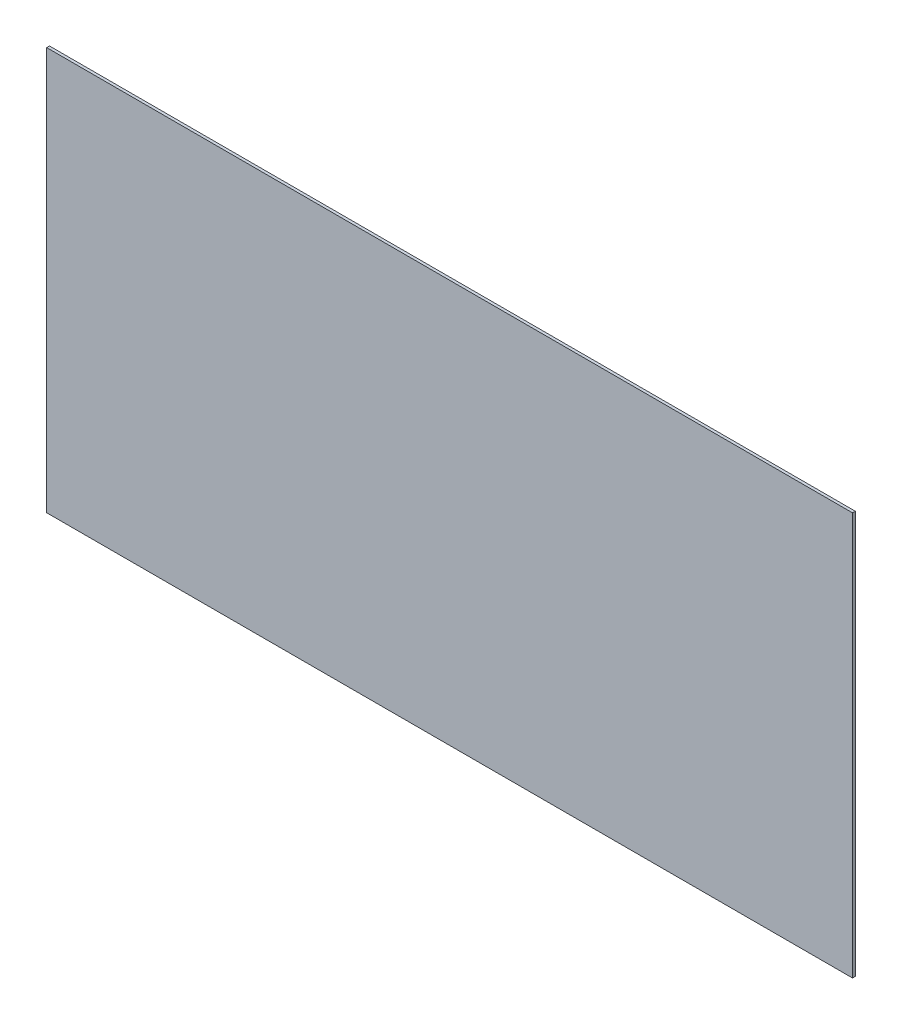
ISO-10303-21;
HEADER;
FILE_DESCRIPTION(('STEP AP214'),'2;1');
FILE_NAME('part.step','',(''),(''),'','','');
FILE_SCHEMA(('AUTOMOTIVE_DESIGN { 1 0 10303 214 1 1 1 1 }'));
ENDSEC;
DATA;
#1=APPLICATION_CONTEXT('core data for automotive mechanical design processes');
#2=APPLICATION_PROTOCOL_DEFINITION('international standard','automotive_design',2000,#1);
#3=PRODUCT_CONTEXT('',#1,'mechanical');
#4=PRODUCT('Part','Part','',(#3));
#5=PRODUCT_RELATED_PRODUCT_CATEGORY('part','',(#4));
#6=PRODUCT_DEFINITION_FORMATION('','',#4);
#7=PRODUCT_DEFINITION_CONTEXT('part definition',#1,'design');
#8=PRODUCT_DEFINITION('design','',#6,#7);
#9=PRODUCT_DEFINITION_SHAPE('','',#8);
#10=(LENGTH_UNIT() NAMED_UNIT(*) SI_UNIT(.MILLI.,.METRE.));
#11=(NAMED_UNIT(*) PLANE_ANGLE_UNIT() SI_UNIT($,.RADIAN.));
#12=(NAMED_UNIT(*) SI_UNIT($,.STERADIAN.) SOLID_ANGLE_UNIT());
#13=UNCERTAINTY_MEASURE_WITH_UNIT(LENGTH_MEASURE(1.E-05),#10,'distance_accuracy_value','');
#14=(GEOMETRIC_REPRESENTATION_CONTEXT(3) GLOBAL_UNCERTAINTY_ASSIGNED_CONTEXT((#13)) GLOBAL_UNIT_ASSIGNED_CONTEXT((#10,
#11,#12)) REPRESENTATION_CONTEXT('',''));
#15=CARTESIAN_POINT('',(0.,0.,0.));
#16=DIRECTION('',(0.,0.,1.));
#17=DIRECTION('',(1.,0.,0.));
#18=AXIS2_PLACEMENT_3D('',#15,#16,#17);
#19=CARTESIAN_POINT('',(914.4,-457.2,6.35));
#20=DIRECTION('',(-1.,0.,0.));
#21=DIRECTION('',(0.,0.,1.));
#22=AXIS2_PLACEMENT_3D('',#19,#20,#21);
#23=PLANE('',#22);
#24=DIRECTION('',(0.,1.,0.));
#25=VECTOR('',#24,1.);
#26=CARTESIAN_POINT('',(914.4,-457.2,0.));
#27=LINE('',#26,#25);
#28=CARTESIAN_POINT('',(914.4,-457.2,0.));
#29=VERTEX_POINT('',#28);
#30=CARTESIAN_POINT('',(914.4,457.2,0.));
#31=VERTEX_POINT('',#30);
#32=EDGE_CURVE('E96',#29,#31,#27,.T.);
#33=ORIENTED_EDGE('',*,*,#32,.T.);
#34=DIRECTION('',(0.,0.,-1.));
#35=VECTOR('',#34,1.);
#36=CARTESIAN_POINT('',(914.4,457.2,6.35));
#37=LINE('',#36,#35);
#38=CARTESIAN_POINT('',(914.4,457.2,6.35));
#39=VERTEX_POINT('',#38);
#40=EDGE_CURVE('E11',#39,#31,#37,.T.);
#41=ORIENTED_EDGE('',*,*,#40,.F.);
#42=DIRECTION('',(0.,1.,0.));
#43=VECTOR('',#42,1.);
#44=CARTESIAN_POINT('',(914.4,-457.2,6.35));
#45=LINE('',#44,#43);
#46=CARTESIAN_POINT('',(914.4,-457.2,6.35));
#47=VERTEX_POINT('',#46);
#48=EDGE_CURVE('E84',#47,#39,#45,.T.);
#49=ORIENTED_EDGE('',*,*,#48,.F.);
#50=DIRECTION('',(0.,0.,-1.));
#51=VECTOR('',#50,1.);
#52=CARTESIAN_POINT('',(914.4,-457.2,6.35));
#53=LINE('',#52,#51);
#54=EDGE_CURVE('E92',#47,#29,#53,.T.);
#55=ORIENTED_EDGE('',*,*,#54,.T.);
#56=EDGE_LOOP('',(#33,#41,#49,#55));
#57=FACE_BOUND('',#56,.T.);
#58=ADVANCED_FACE('F33',(#57),#23,.F.);
#59=CARTESIAN_POINT('',(-914.4,457.2,6.35));
#60=DIRECTION('',(0.,-1.,0.));
#61=DIRECTION('',(0.,0.,-1.));
#62=AXIS2_PLACEMENT_3D('',#59,#60,#61);
#63=PLANE('',#62);
#64=DIRECTION('',(-1.,0.,0.));
#65=VECTOR('',#64,1.);
#66=CARTESIAN_POINT('',(-914.4,457.2,0.));
#67=LINE('',#66,#65);
#68=CARTESIAN_POINT('',(-914.4,457.2,0.));
#69=VERTEX_POINT('',#68);
#70=EDGE_CURVE('E88',#31,#69,#67,.T.);
#71=ORIENTED_EDGE('',*,*,#70,.T.);
#72=DIRECTION('',(0.,0.,-1.));
#73=VECTOR('',#72,1.);
#74=CARTESIAN_POINT('',(-914.4,457.2,6.35));
#75=LINE('',#74,#73);
#76=CARTESIAN_POINT('',(-914.4,457.2,6.35));
#77=VERTEX_POINT('',#76);
#78=EDGE_CURVE('E41',#77,#69,#75,.T.);
#79=ORIENTED_EDGE('',*,*,#78,.F.);
#80=DIRECTION('',(-1.,0.,0.));
#81=VECTOR('',#80,1.);
#82=CARTESIAN_POINT('',(-914.4,457.2,6.35));
#83=LINE('',#82,#81);
#84=EDGE_CURVE('E79',#39,#77,#83,.T.);
#85=ORIENTED_EDGE('',*,*,#84,.F.);
#86=ORIENTED_EDGE('',*,*,#40,.T.);
#87=EDGE_LOOP('',(#71,#79,#85,#86));
#88=FACE_BOUND('',#87,.T.);
#89=ADVANCED_FACE('F87',(#88),#63,.F.);
#90=CARTESIAN_POINT('',(-914.4,-457.2,6.35));
#91=DIRECTION('',(1.,0.,0.));
#92=DIRECTION('',(0.,0.,-1.));
#93=AXIS2_PLACEMENT_3D('',#90,#91,#92);
#94=PLANE('',#93);
#95=DIRECTION('',(0.,-1.,0.));
#96=VECTOR('',#95,1.);
#97=CARTESIAN_POINT('',(-914.4,-457.2,0.));
#98=LINE('',#97,#96);
#99=CARTESIAN_POINT('',(-914.4,-457.2,0.));
#100=VERTEX_POINT('',#99);
#101=EDGE_CURVE('E66',#69,#100,#98,.T.);
#102=ORIENTED_EDGE('',*,*,#101,.T.);
#103=DIRECTION('',(0.,0.,-1.));
#104=VECTOR('',#103,1.);
#105=CARTESIAN_POINT('',(-914.4,-457.2,6.35));
#106=LINE('',#105,#104);
#107=CARTESIAN_POINT('',(-914.4,-457.2,6.35));
#108=VERTEX_POINT('',#107);
#109=EDGE_CURVE('E89',#108,#100,#106,.T.);
#110=ORIENTED_EDGE('',*,*,#109,.F.);
#111=DIRECTION('',(0.,-1.,0.));
#112=VECTOR('',#111,1.);
#113=CARTESIAN_POINT('',(-914.4,-457.2,6.35));
#114=LINE('',#113,#112);
#115=EDGE_CURVE('E82',#77,#108,#114,.T.);
#116=ORIENTED_EDGE('',*,*,#115,.F.);
#117=ORIENTED_EDGE('',*,*,#78,.T.);
#118=EDGE_LOOP('',(#102,#110,#116,#117));
#119=FACE_BOUND('',#118,.T.);
#120=ADVANCED_FACE('F90',(#119),#94,.F.);
#121=CARTESIAN_POINT('',(-914.4,-457.2,6.35));
#122=DIRECTION('',(0.,1.,0.));
#123=DIRECTION('',(0.,0.,1.));
#124=AXIS2_PLACEMENT_3D('',#121,#122,#123);
#125=PLANE('',#124);
#126=DIRECTION('',(1.,0.,0.));
#127=VECTOR('',#126,1.);
#128=CARTESIAN_POINT('',(-914.4,-457.2,0.));
#129=LINE('',#128,#127);
#130=EDGE_CURVE('E72',#100,#29,#129,.T.);
#131=ORIENTED_EDGE('',*,*,#130,.T.);
#132=ORIENTED_EDGE('',*,*,#54,.F.);
#133=DIRECTION('',(1.,0.,0.));
#134=VECTOR('',#133,1.);
#135=CARTESIAN_POINT('',(-914.4,-457.2,6.35));
#136=LINE('',#135,#134);
#137=EDGE_CURVE('E49',#108,#47,#136,.T.);
#138=ORIENTED_EDGE('',*,*,#137,.F.);
#139=ORIENTED_EDGE('',*,*,#109,.T.);
#140=EDGE_LOOP('',(#131,#132,#138,#139));
#141=FACE_BOUND('',#140,.T.);
#142=ADVANCED_FACE('F103',(#141),#125,.F.);
#143=CARTESIAN_POINT('',(0.,0.,6.35));
#144=DIRECTION('',(0.,0.,-1.));
#145=DIRECTION('',(-1.,0.,0.));
#146=AXIS2_PLACEMENT_3D('',#143,#144,#145);
#147=PLANE('',#146);
#148=ORIENTED_EDGE('',*,*,#48,.T.);
#149=ORIENTED_EDGE('',*,*,#84,.T.);
#150=ORIENTED_EDGE('',*,*,#115,.T.);
#151=ORIENTED_EDGE('',*,*,#137,.T.);
#152=EDGE_LOOP('',(#148,#149,#150,#151));
#153=FACE_BOUND('',#152,.T.);
#154=ADVANCED_FACE('F80',(#153),#147,.F.);
#155=CARTESIAN_POINT('',(0.,0.,0.));
#156=DIRECTION('',(0.,0.,-1.));
#157=DIRECTION('',(-1.,0.,0.));
#158=AXIS2_PLACEMENT_3D('',#155,#156,#157);
#159=PLANE('',#158);
#160=ORIENTED_EDGE('',*,*,#32,.F.);
#161=ORIENTED_EDGE('',*,*,#130,.F.);
#162=ORIENTED_EDGE('',*,*,#101,.F.);
#163=ORIENTED_EDGE('',*,*,#70,.F.);
#164=EDGE_LOOP('',(#160,#161,#162,#163));
#165=FACE_BOUND('',#164,.T.);
#166=ADVANCED_FACE('F106',(#165),#159,.T.);
#167=CLOSED_SHELL('',(#58,#89,#120,#142,#154,#166));
#168=MANIFOLD_SOLID_BREP('B2',#167);
#169=ADVANCED_BREP_SHAPE_REPRESENTATION('',(#18,#168),#14);
#170=SHAPE_DEFINITION_REPRESENTATION(#9,#169);
ENDSEC;
END-ISO-10303-21;
